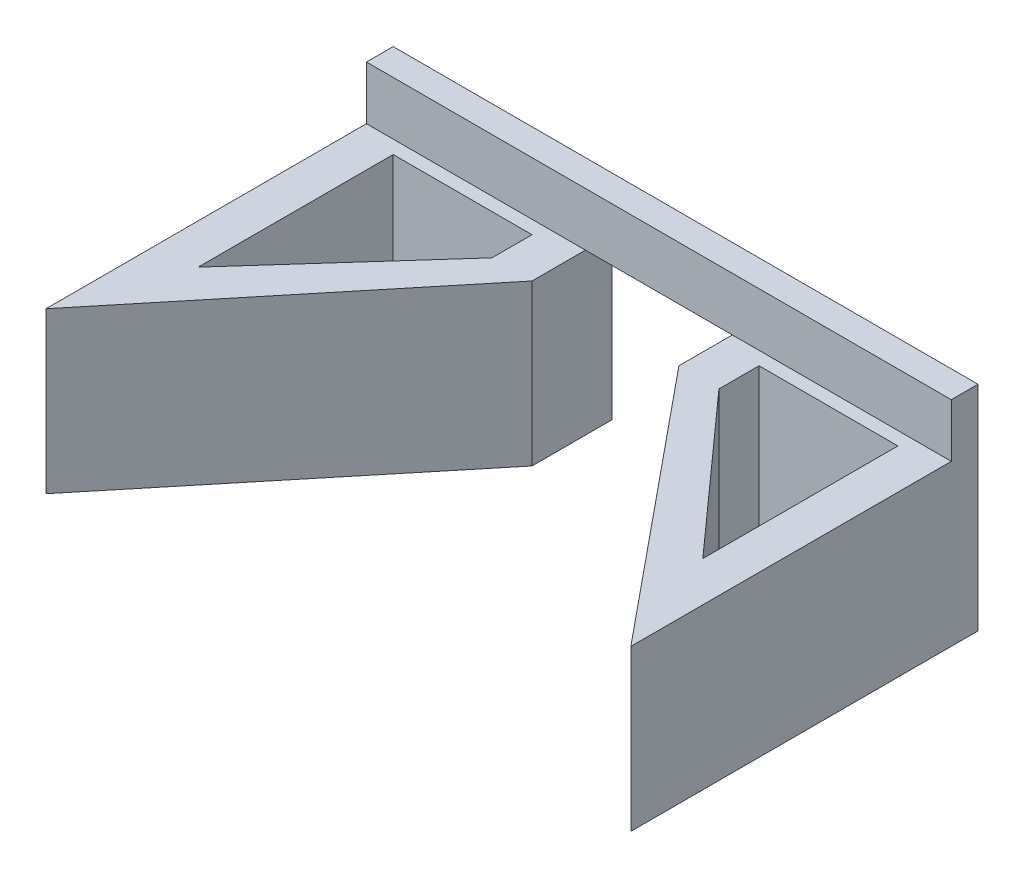
ISO-10303-21;
HEADER;
FILE_DESCRIPTION(('STEP AP214'),'2;1');
FILE_NAME('part.step','',(''),(''),'','','');
FILE_SCHEMA(('AUTOMOTIVE_DESIGN { 1 0 10303 214 1 1 1 1 }'));
ENDSEC;
DATA;
#1=APPLICATION_CONTEXT('core data for automotive mechanical design processes');
#2=APPLICATION_PROTOCOL_DEFINITION('international standard','automotive_design',2000,#1);
#3=PRODUCT_CONTEXT('',#1,'mechanical');
#4=PRODUCT('Part','Part','',(#3));
#5=PRODUCT_RELATED_PRODUCT_CATEGORY('part','',(#4));
#6=PRODUCT_DEFINITION_FORMATION('','',#4);
#7=PRODUCT_DEFINITION_CONTEXT('part definition',#1,'design');
#8=PRODUCT_DEFINITION('design','',#6,#7);
#9=PRODUCT_DEFINITION_SHAPE('','',#8);
#10=(LENGTH_UNIT() NAMED_UNIT(*) SI_UNIT(.MILLI.,.METRE.));
#11=(NAMED_UNIT(*) PLANE_ANGLE_UNIT() SI_UNIT($,.RADIAN.));
#12=(NAMED_UNIT(*) SI_UNIT($,.STERADIAN.) SOLID_ANGLE_UNIT());
#13=UNCERTAINTY_MEASURE_WITH_UNIT(LENGTH_MEASURE(1.E-05),#10,'distance_accuracy_value','');
#14=(GEOMETRIC_REPRESENTATION_CONTEXT(3) GLOBAL_UNCERTAINTY_ASSIGNED_CONTEXT((#13)) GLOBAL_UNIT_ASSIGNED_CONTEXT((#10,
#11,#12)) REPRESENTATION_CONTEXT('',''));
#15=CARTESIAN_POINT('',(0.,0.,0.));
#16=DIRECTION('',(0.,0.,1.));
#17=DIRECTION('',(1.,0.,0.));
#18=AXIS2_PLACEMENT_3D('',#15,#16,#17);
#19=CARTESIAN_POINT('',(0.,60.,0.));
#20=DIRECTION('',(0.,1.,0.));
#21=DIRECTION('',(0.,0.,1.));
#22=AXIS2_PLACEMENT_3D('',#19,#20,#21);
#23=PLANE('',#22);
#24=DIRECTION('',(0.,0.,1.));
#25=VECTOR('',#24,1.);
#26=CARTESIAN_POINT('',(27.5,60.,-12.7008032128514));
#27=LINE('',#26,#25);
#28=CARTESIAN_POINT('',(27.5,60.,-42.7008032128514));
#29=VERTEX_POINT('',#28);
#30=CARTESIAN_POINT('',(27.5,60.,-32.7008032128514));
#31=VERTEX_POINT('',#30);
#32=EDGE_CURVE('E234',#29,#31,#27,.T.);
#33=ORIENTED_EDGE('',*,*,#32,.T.);
#34=DIRECTION('',(1.,0.,0.));
#35=VECTOR('',#34,1.);
#36=CARTESIAN_POINT('',(-109.5,60.,-32.7008032128514));
#37=LINE('',#36,#35);
#38=CARTESIAN_POINT('',(-27.5,60.,-32.7008032128514));
#39=VERTEX_POINT('',#38);
#40=EDGE_CURVE('E268',#39,#31,#37,.T.);
#41=ORIENTED_EDGE('',*,*,#40,.F.);
#42=DIRECTION('',(0.,0.,-1.));
#43=VECTOR('',#42,1.);
#44=CARTESIAN_POINT('',(-27.5,60.,-12.7008032128514));
#45=LINE('',#44,#43);
#46=CARTESIAN_POINT('',(-27.5,60.,-42.7008032128514));
#47=VERTEX_POINT('',#46);
#48=EDGE_CURVE('E348',#39,#47,#45,.T.);
#49=ORIENTED_EDGE('',*,*,#48,.T.);
#50=DIRECTION('',(-1.,0.,0.));
#51=VECTOR('',#50,1.);
#52=CARTESIAN_POINT('',(-109.5,60.,-42.7008032128514));
#53=LINE('',#52,#51);
#54=EDGE_CURVE('E274',#29,#47,#53,.T.);
#55=ORIENTED_EDGE('',*,*,#54,.F.);
#56=EDGE_LOOP('',(#33,#41,#49,#55));
#57=FACE_BOUND('',#56,.T.);
#58=ADVANCED_FACE('F41',(#57),#23,.F.);
#59=CARTESIAN_POINT('',(0.,60.,0.));
#60=DIRECTION('',(0.,1.,0.));
#61=DIRECTION('',(0.,0.,1.));
#62=AXIS2_PLACEMENT_3D('',#59,#60,#61);
#63=PLANE('',#62);
#64=CARTESIAN_POINT('',(-109.5,60.,-32.7008032128514));
#65=VERTEX_POINT('',#64);
#66=EDGE_CURVE('E57',#65,#39,#37,.T.);
#67=ORIENTED_EDGE('',*,*,#66,.F.);
#68=DIRECTION('',(0.,0.,1.));
#69=VECTOR('',#68,1.);
#70=CARTESIAN_POINT('',(-109.5,60.,-42.7008032128514));
#71=LINE('',#70,#69);
#72=CARTESIAN_POINT('',(-109.5,60.,87.2991967871486));
#73=VERTEX_POINT('',#72);
#74=EDGE_CURVE('E341',#65,#73,#71,.T.);
#75=ORIENTED_EDGE('',*,*,#74,.T.);
#76=DIRECTION('',(0.634079588207047,0.,-0.773267790496399));
#77=VECTOR('',#76,1.);
#78=CARTESIAN_POINT('',(-109.5,60.,87.2991967871486));
#79=LINE('',#78,#77);
#80=CARTESIAN_POINT('',(-27.5,60.,-12.7008032128514));
#81=VERTEX_POINT('',#80);
#82=EDGE_CURVE('E344',#73,#81,#79,.T.);
#83=ORIENTED_EDGE('',*,*,#82,.T.);
#84=EDGE_CURVE('E349',#81,#39,#45,.T.);
#85=ORIENTED_EDGE('',*,*,#84,.T.);
#86=EDGE_LOOP('',(#67,#75,#83,#85));
#87=FACE_BOUND('',#86,.T.);
#88=DIRECTION('',(0.,0.,1.));
#89=VECTOR('',#88,1.);
#90=CARTESIAN_POINT('',(-94.5,60.,-27.7008032128514));
#91=LINE('',#90,#89);
#92=CARTESIAN_POINT('',(-94.5,60.,-27.7008032128514));
#93=VERTEX_POINT('',#92);
#94=CARTESIAN_POINT('',(-94.5,60.,45.3501775281332));
#95=VERTEX_POINT('',#94);
#96=EDGE_CURVE('E303',#93,#95,#91,.T.);
#97=ORIENTED_EDGE('',*,*,#96,.F.);
#98=DIRECTION('',(-1.,0.,0.));
#99=VECTOR('',#98,1.);
#100=CARTESIAN_POINT('',(-42.5,60.,-27.7008032128514));
#101=LINE('',#100,#99);
#102=CARTESIAN_POINT('',(-42.5,60.,-27.7008032128514));
#103=VERTEX_POINT('',#102);
#104=EDGE_CURVE('E300',#103,#93,#101,.T.);
#105=ORIENTED_EDGE('',*,*,#104,.F.);
#106=DIRECTION('',(0.,0.,-1.));
#107=VECTOR('',#106,1.);
#108=CARTESIAN_POINT('',(-42.5,60.,-12.7008032128502));
#109=LINE('',#108,#107);
#110=CARTESIAN_POINT('',(-42.5,60.,-12.7008032128502));
#111=VERTEX_POINT('',#110);
#112=EDGE_CURVE('E310',#111,#103,#109,.T.);
#113=ORIENTED_EDGE('',*,*,#112,.F.);
#114=DIRECTION('',(0.667219821763452,0.,-0.744860865830625));
#115=VECTOR('',#114,1.);
#116=CARTESIAN_POINT('',(-94.5,60.,45.3501775281332));
#117=LINE('',#116,#115);
#118=EDGE_CURVE('E307',#95,#111,#117,.T.);
#119=ORIENTED_EDGE('',*,*,#118,.F.);
#120=EDGE_LOOP('',(#97,#105,#113,#119));
#121=FACE_BOUND('',#120,.T.);
#122=ADVANCED_FACE('F438',(#87,#121),#63,.T.);
#123=CARTESIAN_POINT('',(0.,0.,0.));
#124=DIRECTION('',(0.,1.,0.));
#125=DIRECTION('',(0.,0.,1.));
#126=AXIS2_PLACEMENT_3D('',#123,#124,#125);
#127=PLANE('',#126);
#128=DIRECTION('',(0.,0.,1.));
#129=VECTOR('',#128,1.);
#130=CARTESIAN_POINT('',(-109.5,0.,-12.7008032128514));
#131=LINE('',#130,#129);
#132=CARTESIAN_POINT('',(-109.5,0.,-42.7008032128514));
#133=VERTEX_POINT('',#132);
#134=CARTESIAN_POINT('',(-109.5,0.,87.2991967871486));
#135=VERTEX_POINT('',#134);
#136=EDGE_CURVE('E340',#133,#135,#131,.T.);
#137=ORIENTED_EDGE('',*,*,#136,.F.);
#138=DIRECTION('',(-1.,0.,0.));
#139=VECTOR('',#138,1.);
#140=CARTESIAN_POINT('',(-109.5,0.,-42.7008032128514));
#141=LINE('',#140,#139);
#142=CARTESIAN_POINT('',(-27.5,0.,-42.7008032128514));
#143=VERTEX_POINT('',#142);
#144=EDGE_CURVE('E345',#143,#133,#141,.T.);
#145=ORIENTED_EDGE('',*,*,#144,.F.);
#146=DIRECTION('',(0.,0.,-1.));
#147=VECTOR('',#146,1.);
#148=CARTESIAN_POINT('',(-27.5,0.,-12.7008032128514));
#149=LINE('',#148,#147);
#150=CARTESIAN_POINT('',(-27.5,0.,-12.7008032128514));
#151=VERTEX_POINT('',#150);
#152=EDGE_CURVE('E358',#151,#143,#149,.T.);
#153=ORIENTED_EDGE('',*,*,#152,.F.);
#154=DIRECTION('',(0.634079588207047,0.,-0.773267790496399));
#155=VECTOR('',#154,1.);
#156=CARTESIAN_POINT('',(-109.5,0.,87.2991967871486));
#157=LINE('',#156,#155);
#158=EDGE_CURVE('E355',#135,#151,#157,.T.);
#159=ORIENTED_EDGE('',*,*,#158,.F.);
#160=EDGE_LOOP('',(#137,#145,#153,#159));
#161=FACE_BOUND('',#160,.T.);
#162=DIRECTION('',(-1.,0.,0.));
#163=VECTOR('',#162,1.);
#164=CARTESIAN_POINT('',(-42.5,0.,-27.7008032128514));
#165=LINE('',#164,#163);
#166=CARTESIAN_POINT('',(-42.5,0.,-27.7008032128514));
#167=VERTEX_POINT('',#166);
#168=CARTESIAN_POINT('',(-94.5,0.,-27.7008032128514));
#169=VERTEX_POINT('',#168);
#170=EDGE_CURVE('E299',#167,#169,#165,.T.);
#171=ORIENTED_EDGE('',*,*,#170,.T.);
#172=DIRECTION('',(0.,0.,1.));
#173=VECTOR('',#172,1.);
#174=CARTESIAN_POINT('',(-94.5,0.,-27.7008032128514));
#175=LINE('',#174,#173);
#176=CARTESIAN_POINT('',(-94.5,0.,45.3501775281332));
#177=VERTEX_POINT('',#176);
#178=EDGE_CURVE('E317',#169,#177,#175,.T.);
#179=ORIENTED_EDGE('',*,*,#178,.T.);
#180=DIRECTION('',(0.667219821763452,0.,-0.744860865830625));
#181=VECTOR('',#180,1.);
#182=CARTESIAN_POINT('',(-94.5,0.,45.3501775281332));
#183=LINE('',#182,#181);
#184=CARTESIAN_POINT('',(-42.5,0.,-12.7008032128502));
#185=VERTEX_POINT('',#184);
#186=EDGE_CURVE('E321',#177,#185,#183,.T.);
#187=ORIENTED_EDGE('',*,*,#186,.T.);
#188=DIRECTION('',(0.,0.,-1.));
#189=VECTOR('',#188,1.);
#190=CARTESIAN_POINT('',(-42.5,0.,-12.7008032128502));
#191=LINE('',#190,#189);
#192=EDGE_CURVE('E304',#185,#167,#191,.T.);
#193=ORIENTED_EDGE('',*,*,#192,.T.);
#194=EDGE_LOOP('',(#171,#179,#187,#193));
#195=FACE_BOUND('',#194,.T.);
#196=ADVANCED_FACE('F384',(#161,#195),#127,.F.);
#197=CARTESIAN_POINT('',(-109.5,60.,-12.7008032128514));
#198=DIRECTION('',(1.,0.,0.));
#199=DIRECTION('',(0.,0.,-1.));
#200=AXIS2_PLACEMENT_3D('',#197,#198,#199);
#201=PLANE('',#200);
#202=ORIENTED_EDGE('',*,*,#136,.T.);
#203=DIRECTION('',(0.,-1.,0.));
#204=VECTOR('',#203,1.);
#205=CARTESIAN_POINT('',(-109.5,60.,87.2991967871486));
#206=LINE('',#205,#204);
#207=EDGE_CURVE('E11',#73,#135,#206,.T.);
#208=ORIENTED_EDGE('',*,*,#207,.F.);
#209=ORIENTED_EDGE('',*,*,#74,.F.);
#210=DIRECTION('',(0.,-1.,0.));
#211=VECTOR('',#210,1.);
#212=CARTESIAN_POINT('',(-109.5,80.,-32.7008032128514));
#213=LINE('',#212,#211);
#214=CARTESIAN_POINT('',(-109.5,80.,-32.7008032128514));
#215=VERTEX_POINT('',#214);
#216=EDGE_CURVE('E295',#215,#65,#213,.T.);
#217=ORIENTED_EDGE('',*,*,#216,.F.);
#218=DIRECTION('',(0.,0.,1.));
#219=VECTOR('',#218,1.);
#220=CARTESIAN_POINT('',(-109.5,80.,-42.7008032128514));
#221=LINE('',#220,#219);
#222=CARTESIAN_POINT('',(-109.5,80.,-42.7008032128514));
#223=VERTEX_POINT('',#222);
#224=EDGE_CURVE('E269',#223,#215,#221,.T.);
#225=ORIENTED_EDGE('',*,*,#224,.F.);
#226=DIRECTION('',(0.,-1.,0.));
#227=VECTOR('',#226,1.);
#228=CARTESIAN_POINT('',(-109.5,60.,-42.7008032128514));
#229=LINE('',#228,#227);
#230=EDGE_CURVE('E352',#223,#133,#229,.T.);
#231=ORIENTED_EDGE('',*,*,#230,.T.);
#232=EDGE_LOOP('',(#202,#208,#209,#217,#225,#231));
#233=FACE_BOUND('',#232,.T.);
#234=ADVANCED_FACE('F43',(#233),#201,.F.);
#235=CARTESIAN_POINT('',(-109.5,60.,87.2991967871486));
#236=DIRECTION('',(-0.773267790496399,0.,-0.634079588207046));
#237=DIRECTION('',(-0.634079588207047,0.,0.773267790496399));
#238=AXIS2_PLACEMENT_3D('',#235,#236,#237);
#239=PLANE('',#238);
#240=ORIENTED_EDGE('',*,*,#158,.T.);
#241=DIRECTION('',(0.,-1.,0.));
#242=VECTOR('',#241,1.);
#243=CARTESIAN_POINT('',(-27.5,60.,-12.7008032128514));
#244=LINE('',#243,#242);
#245=EDGE_CURVE('E50',#81,#151,#244,.T.);
#246=ORIENTED_EDGE('',*,*,#245,.F.);
#247=ORIENTED_EDGE('',*,*,#82,.F.);
#248=ORIENTED_EDGE('',*,*,#207,.T.);
#249=EDGE_LOOP('',(#240,#246,#247,#248));
#250=FACE_BOUND('',#249,.T.);
#251=ADVANCED_FACE('F532',(#250),#239,.F.);
#252=CARTESIAN_POINT('',(-27.5,60.,-12.7008032128514));
#253=DIRECTION('',(-1.,0.,0.));
#254=DIRECTION('',(0.,0.,1.));
#255=AXIS2_PLACEMENT_3D('',#252,#253,#254);
#256=PLANE('',#255);
#257=ORIENTED_EDGE('',*,*,#152,.T.);
#258=DIRECTION('',(0.,-1.,0.));
#259=VECTOR('',#258,1.);
#260=CARTESIAN_POINT('',(-27.5,60.,-42.7008032128514));
#261=LINE('',#260,#259);
#262=EDGE_CURVE('E367',#47,#143,#261,.T.);
#263=ORIENTED_EDGE('',*,*,#262,.F.);
#264=ORIENTED_EDGE('',*,*,#48,.F.);
#265=ORIENTED_EDGE('',*,*,#84,.F.);
#266=ORIENTED_EDGE('',*,*,#245,.T.);
#267=EDGE_LOOP('',(#257,#263,#264,#265,#266));
#268=FACE_BOUND('',#267,.T.);
#269=ADVANCED_FACE('F376',(#268),#256,.F.);
#270=CARTESIAN_POINT('',(-109.5,60.,-42.7008032128514));
#271=DIRECTION('',(0.,0.,1.));
#272=DIRECTION('',(1.,0.,0.));
#273=AXIS2_PLACEMENT_3D('',#270,#271,#272);
#274=PLANE('',#273);
#275=ORIENTED_EDGE('',*,*,#144,.T.);
#276=ORIENTED_EDGE('',*,*,#230,.F.);
#277=DIRECTION('',(-1.,0.,0.));
#278=VECTOR('',#277,1.);
#279=CARTESIAN_POINT('',(-109.5,80.,-42.7008032128514));
#280=LINE('',#279,#278);
#281=CARTESIAN_POINT('',(109.5,80.,-42.7008032128514));
#282=VERTEX_POINT('',#281);
#283=EDGE_CURVE('E280',#282,#223,#280,.T.);
#284=ORIENTED_EDGE('',*,*,#283,.F.);
#285=DIRECTION('',(0.,-1.,0.));
#286=VECTOR('',#285,1.);
#287=CARTESIAN_POINT('',(109.5,80.,-42.7008032128514));
#288=LINE('',#287,#286);
#289=CARTESIAN_POINT('',(109.5,0.,-42.7008032128514));
#290=VERTEX_POINT('',#289);
#291=EDGE_CURVE('E284',#282,#290,#288,.T.);
#292=ORIENTED_EDGE('',*,*,#291,.T.);
#293=DIRECTION('',(-1.,0.,0.));
#294=VECTOR('',#293,1.);
#295=CARTESIAN_POINT('',(109.5,0.,-42.7008032128514));
#296=LINE('',#295,#294);
#297=CARTESIAN_POINT('',(27.5,0.,-42.7008032128514));
#298=VERTEX_POINT('',#297);
#299=EDGE_CURVE('E194',#290,#298,#296,.T.);
#300=ORIENTED_EDGE('',*,*,#299,.T.);
#301=DIRECTION('',(0.,-1.,0.));
#302=VECTOR('',#301,1.);
#303=CARTESIAN_POINT('',(27.5,60.,-42.7008032128514));
#304=LINE('',#303,#302);
#305=EDGE_CURVE('E261',#29,#298,#304,.T.);
#306=ORIENTED_EDGE('',*,*,#305,.F.);
#307=ORIENTED_EDGE('',*,*,#54,.T.);
#308=ORIENTED_EDGE('',*,*,#262,.T.);
#309=EDGE_LOOP('',(#275,#276,#284,#292,#300,#306,#307,#308));
#310=FACE_BOUND('',#309,.T.);
#311=ADVANCED_FACE('F387',(#310),#274,.F.);
#312=CARTESIAN_POINT('',(-42.5,60.,-27.7008032128514));
#313=DIRECTION('',(0.,0.,1.));
#314=DIRECTION('',(1.,0.,0.));
#315=AXIS2_PLACEMENT_3D('',#312,#313,#314);
#316=PLANE('',#315);
#317=ORIENTED_EDGE('',*,*,#170,.F.);
#318=DIRECTION('',(0.,-1.,0.));
#319=VECTOR('',#318,1.);
#320=CARTESIAN_POINT('',(-42.5,60.,-27.7008032128514));
#321=LINE('',#320,#319);
#322=EDGE_CURVE('E313',#103,#167,#321,.T.);
#323=ORIENTED_EDGE('',*,*,#322,.F.);
#324=ORIENTED_EDGE('',*,*,#104,.T.);
#325=DIRECTION('',(0.,-1.,0.));
#326=VECTOR('',#325,1.);
#327=CARTESIAN_POINT('',(-94.5,60.,-27.7008032128514));
#328=LINE('',#327,#326);
#329=EDGE_CURVE('E336',#93,#169,#328,.T.);
#330=ORIENTED_EDGE('',*,*,#329,.T.);
#331=EDGE_LOOP('',(#317,#323,#324,#330));
#332=FACE_BOUND('',#331,.T.);
#333=ADVANCED_FACE('F520',(#332),#316,.T.);
#334=CARTESIAN_POINT('',(-94.5,60.,-27.7008032128514));
#335=DIRECTION('',(1.,0.,0.));
#336=DIRECTION('',(0.,0.,-1.));
#337=AXIS2_PLACEMENT_3D('',#334,#335,#336);
#338=PLANE('',#337);
#339=ORIENTED_EDGE('',*,*,#178,.F.);
#340=ORIENTED_EDGE('',*,*,#329,.F.);
#341=ORIENTED_EDGE('',*,*,#96,.T.);
#342=DIRECTION('',(0.,-1.,0.));
#343=VECTOR('',#342,1.);
#344=CARTESIAN_POINT('',(-94.5,60.,45.3501775281332));
#345=LINE('',#344,#343);
#346=EDGE_CURVE('E333',#95,#177,#345,.T.);
#347=ORIENTED_EDGE('',*,*,#346,.T.);
#348=EDGE_LOOP('',(#339,#340,#341,#347));
#349=FACE_BOUND('',#348,.T.);
#350=ADVANCED_FACE('F569',(#349),#338,.T.);
#351=CARTESIAN_POINT('',(-94.5,60.,45.3501775281332));
#352=DIRECTION('',(-0.744860865830625,0.,-0.667219821763452));
#353=DIRECTION('',(-0.667219821763452,0.,0.744860865830625));
#354=AXIS2_PLACEMENT_3D('',#351,#352,#353);
#355=PLANE('',#354);
#356=ORIENTED_EDGE('',*,*,#186,.F.);
#357=ORIENTED_EDGE('',*,*,#346,.F.);
#358=ORIENTED_EDGE('',*,*,#118,.T.);
#359=DIRECTION('',(0.,-1.,0.));
#360=VECTOR('',#359,1.);
#361=CARTESIAN_POINT('',(-42.5,60.,-12.7008032128502));
#362=LINE('',#361,#360);
#363=EDGE_CURVE('E65',#111,#185,#362,.T.);
#364=ORIENTED_EDGE('',*,*,#363,.T.);
#365=EDGE_LOOP('',(#356,#357,#358,#364));
#366=FACE_BOUND('',#365,.T.);
#367=ADVANCED_FACE('F435',(#366),#355,.T.);
#368=CARTESIAN_POINT('',(-42.5,60.,-12.7008032128502));
#369=DIRECTION('',(-1.,0.,0.));
#370=DIRECTION('',(0.,0.,1.));
#371=AXIS2_PLACEMENT_3D('',#368,#369,#370);
#372=PLANE('',#371);
#373=ORIENTED_EDGE('',*,*,#192,.F.);
#374=ORIENTED_EDGE('',*,*,#363,.F.);
#375=ORIENTED_EDGE('',*,*,#112,.T.);
#376=ORIENTED_EDGE('',*,*,#322,.T.);
#377=EDGE_LOOP('',(#373,#374,#375,#376));
#378=FACE_BOUND('',#377,.T.);
#379=ADVANCED_FACE('F428',(#378),#372,.T.);
#380=CARTESIAN_POINT('',(-109.5,80.,-32.7008032128514));
#381=DIRECTION('',(0.,0.,-1.));
#382=DIRECTION('',(-1.,0.,0.));
#383=AXIS2_PLACEMENT_3D('',#380,#381,#382);
#384=PLANE('',#383);
#385=ORIENTED_EDGE('',*,*,#66,.T.);
#386=ORIENTED_EDGE('',*,*,#40,.T.);
#387=DIRECTION('',(-1.,0.,0.));
#388=VECTOR('',#387,1.);
#389=CARTESIAN_POINT('',(-109.5,60.,-32.7008032128514));
#390=LINE('',#389,#388);
#391=CARTESIAN_POINT('',(109.5,60.,-32.7008032128514));
#392=VERTEX_POINT('',#391);
#393=EDGE_CURVE('E265',#392,#31,#390,.T.);
#394=ORIENTED_EDGE('',*,*,#393,.F.);
#395=DIRECTION('',(0.,-1.,0.));
#396=VECTOR('',#395,1.);
#397=CARTESIAN_POINT('',(109.5,80.,-32.7008032128514));
#398=LINE('',#397,#396);
#399=CARTESIAN_POINT('',(109.5,80.,-32.7008032128514));
#400=VERTEX_POINT('',#399);
#401=EDGE_CURVE('E291',#400,#392,#398,.T.);
#402=ORIENTED_EDGE('',*,*,#401,.F.);
#403=DIRECTION('',(1.,0.,0.));
#404=VECTOR('',#403,1.);
#405=CARTESIAN_POINT('',(-109.5,80.,-32.7008032128514));
#406=LINE('',#405,#404);
#407=EDGE_CURVE('E273',#215,#400,#406,.T.);
#408=ORIENTED_EDGE('',*,*,#407,.F.);
#409=ORIENTED_EDGE('',*,*,#216,.T.);
#410=EDGE_LOOP('',(#385,#386,#394,#402,#408,#409));
#411=FACE_BOUND('',#410,.T.);
#412=ADVANCED_FACE('F426',(#411),#384,.F.);
#413=CARTESIAN_POINT('',(109.5,80.,-42.7008032128514));
#414=DIRECTION('',(-1.,0.,0.));
#415=DIRECTION('',(0.,0.,1.));
#416=AXIS2_PLACEMENT_3D('',#413,#414,#415);
#417=PLANE('',#416);
#418=ORIENTED_EDGE('',*,*,#401,.T.);
#419=DIRECTION('',(0.,0.,-1.));
#420=VECTOR('',#419,1.);
#421=CARTESIAN_POINT('',(109.5,60.,-42.7008032128514));
#422=LINE('',#421,#420);
#423=CARTESIAN_POINT('',(109.5,60.,87.2991967871486));
#424=VERTEX_POINT('',#423);
#425=EDGE_CURVE('E229',#424,#392,#422,.T.);
#426=ORIENTED_EDGE('',*,*,#425,.F.);
#427=DIRECTION('',(0.,-1.,0.));
#428=VECTOR('',#427,1.);
#429=CARTESIAN_POINT('',(109.5,60.,87.2991967871486));
#430=LINE('',#429,#428);
#431=CARTESIAN_POINT('',(109.5,0.,87.2991967871486));
#432=VERTEX_POINT('',#431);
#433=EDGE_CURVE('E242',#424,#432,#430,.T.);
#434=ORIENTED_EDGE('',*,*,#433,.T.);
#435=DIRECTION('',(0.,0.,-1.));
#436=VECTOR('',#435,1.);
#437=CARTESIAN_POINT('',(109.5,0.,-12.7008032128514));
#438=LINE('',#437,#436);
#439=EDGE_CURVE('E233',#432,#290,#438,.T.);
#440=ORIENTED_EDGE('',*,*,#439,.T.);
#441=ORIENTED_EDGE('',*,*,#291,.F.);
#442=DIRECTION('',(0.,0.,-1.));
#443=VECTOR('',#442,1.);
#444=CARTESIAN_POINT('',(109.5,80.,-42.7008032128514));
#445=LINE('',#444,#443);
#446=EDGE_CURVE('E277',#400,#282,#445,.T.);
#447=ORIENTED_EDGE('',*,*,#446,.F.);
#448=EDGE_LOOP('',(#418,#426,#434,#440,#441,#447));
#449=FACE_BOUND('',#448,.T.);
#450=ADVANCED_FACE('F401',(#449),#417,.F.);
#451=CARTESIAN_POINT('',(0.,80.,0.));
#452=DIRECTION('',(0.,1.,0.));
#453=DIRECTION('',(0.,0.,1.));
#454=AXIS2_PLACEMENT_3D('',#451,#452,#453);
#455=PLANE('',#454);
#456=ORIENTED_EDGE('',*,*,#224,.T.);
#457=ORIENTED_EDGE('',*,*,#407,.T.);
#458=ORIENTED_EDGE('',*,*,#446,.T.);
#459=ORIENTED_EDGE('',*,*,#283,.T.);
#460=EDGE_LOOP('',(#456,#457,#458,#459));
#461=FACE_BOUND('',#460,.T.);
#462=ADVANCED_FACE('F394',(#461),#455,.T.);
#463=CARTESIAN_POINT('',(0.,60.,0.));
#464=DIRECTION('',(0.,-1.,0.));
#465=DIRECTION('',(0.,0.,-1.));
#466=AXIS2_PLACEMENT_3D('',#463,#464,#465);
#467=PLANE('',#466);
#468=DIRECTION('',(0.667219821763452,0.,0.744860865830625));
#469=VECTOR('',#468,1.);
#470=CARTESIAN_POINT('',(94.5,60.,45.3501775281332));
#471=LINE('',#470,#469);
#472=CARTESIAN_POINT('',(42.5,60.,-12.7008032128502));
#473=VERTEX_POINT('',#472);
#474=CARTESIAN_POINT('',(94.5,60.,45.3501775281332));
#475=VERTEX_POINT('',#474);
#476=EDGE_CURVE('E174',#473,#475,#471,.T.);
#477=ORIENTED_EDGE('',*,*,#476,.F.);
#478=DIRECTION('',(0.,0.,1.));
#479=VECTOR('',#478,1.);
#480=CARTESIAN_POINT('',(42.5,60.,-12.7008032128502));
#481=LINE('',#480,#479);
#482=CARTESIAN_POINT('',(42.5,60.,-27.7008032128514));
#483=VERTEX_POINT('',#482);
#484=EDGE_CURVE('E205',#483,#473,#481,.T.);
#485=ORIENTED_EDGE('',*,*,#484,.F.);
#486=DIRECTION('',(-1.,0.,0.));
#487=VECTOR('',#486,1.);
#488=CARTESIAN_POINT('',(42.5,60.,-27.7008032128514));
#489=LINE('',#488,#487);
#490=CARTESIAN_POINT('',(94.5,60.,-27.7008032128514));
#491=VERTEX_POINT('',#490);
#492=EDGE_CURVE('E201',#491,#483,#489,.T.);
#493=ORIENTED_EDGE('',*,*,#492,.F.);
#494=DIRECTION('',(0.,0.,-1.));
#495=VECTOR('',#494,1.);
#496=CARTESIAN_POINT('',(94.5,60.,-27.7008032128514));
#497=LINE('',#496,#495);
#498=EDGE_CURVE('E185',#475,#491,#497,.T.);
#499=ORIENTED_EDGE('',*,*,#498,.F.);
#500=EDGE_LOOP('',(#477,#485,#493,#499));
#501=FACE_BOUND('',#500,.T.);
#502=ORIENTED_EDGE('',*,*,#425,.T.);
#503=ORIENTED_EDGE('',*,*,#393,.T.);
#504=CARTESIAN_POINT('',(27.5,60.,-12.7008032128514));
#505=VERTEX_POINT('',#504);
#506=EDGE_CURVE('E232',#31,#505,#27,.T.);
#507=ORIENTED_EDGE('',*,*,#506,.T.);
#508=DIRECTION('',(0.634079588207047,0.,0.773267790496399));
#509=VECTOR('',#508,1.);
#510=CARTESIAN_POINT('',(109.5,60.,87.2991967871486));
#511=LINE('',#510,#509);
#512=EDGE_CURVE('E238',#505,#424,#511,.T.);
#513=ORIENTED_EDGE('',*,*,#512,.T.);
#514=EDGE_LOOP('',(#502,#503,#507,#513));
#515=FACE_BOUND('',#514,.T.);
#516=ADVANCED_FACE('F198',(#501,#515),#467,.F.);
#517=CARTESIAN_POINT('',(0.,0.,0.));
#518=DIRECTION('',(0.,-1.,0.));
#519=DIRECTION('',(0.,0.,-1.));
#520=AXIS2_PLACEMENT_3D('',#517,#518,#519);
#521=PLANE('',#520);
#522=ORIENTED_EDGE('',*,*,#299,.F.);
#523=ORIENTED_EDGE('',*,*,#439,.F.);
#524=DIRECTION('',(0.634079588207047,0.,0.773267790496399));
#525=VECTOR('',#524,1.);
#526=CARTESIAN_POINT('',(109.5,0.,87.2991967871486));
#527=LINE('',#526,#525);
#528=CARTESIAN_POINT('',(27.5,0.,-12.7008032128514));
#529=VERTEX_POINT('',#528);
#530=EDGE_CURVE('E248',#529,#432,#527,.T.);
#531=ORIENTED_EDGE('',*,*,#530,.F.);
#532=DIRECTION('',(0.,0.,1.));
#533=VECTOR('',#532,1.);
#534=CARTESIAN_POINT('',(27.5,0.,-12.7008032128514));
#535=LINE('',#534,#533);
#536=EDGE_CURVE('E245',#298,#529,#535,.T.);
#537=ORIENTED_EDGE('',*,*,#536,.F.);
#538=EDGE_LOOP('',(#522,#523,#531,#537));
#539=FACE_BOUND('',#538,.T.);
#540=DIRECTION('',(0.,0.,1.));
#541=VECTOR('',#540,1.);
#542=CARTESIAN_POINT('',(42.5,0.,-12.7008032128502));
#543=LINE('',#542,#541);
#544=CARTESIAN_POINT('',(42.5,0.,-27.7008032128514));
#545=VERTEX_POINT('',#544);
#546=CARTESIAN_POINT('',(42.5,0.,-12.7008032128502));
#547=VERTEX_POINT('',#546);
#548=EDGE_CURVE('E186',#545,#547,#543,.T.);
#549=ORIENTED_EDGE('',*,*,#548,.T.);
#550=DIRECTION('',(0.667219821763452,0.,0.744860865830625));
#551=VECTOR('',#550,1.);
#552=CARTESIAN_POINT('',(94.5,0.,45.3501775281332));
#553=LINE('',#552,#551);
#554=CARTESIAN_POINT('',(94.5,0.,45.3501775281332));
#555=VERTEX_POINT('',#554);
#556=EDGE_CURVE('E210',#547,#555,#553,.T.);
#557=ORIENTED_EDGE('',*,*,#556,.T.);
#558=DIRECTION('',(0.,0.,-1.));
#559=VECTOR('',#558,1.);
#560=CARTESIAN_POINT('',(94.5,0.,-27.7008032128514));
#561=LINE('',#560,#559);
#562=CARTESIAN_POINT('',(94.5,0.,-27.7008032128514));
#563=VERTEX_POINT('',#562);
#564=EDGE_CURVE('E192',#555,#563,#561,.T.);
#565=ORIENTED_EDGE('',*,*,#564,.T.);
#566=DIRECTION('',(-1.,0.,0.));
#567=VECTOR('',#566,1.);
#568=CARTESIAN_POINT('',(42.5,0.,-27.7008032128514));
#569=LINE('',#568,#567);
#570=EDGE_CURVE('E215',#563,#545,#569,.T.);
#571=ORIENTED_EDGE('',*,*,#570,.T.);
#572=EDGE_LOOP('',(#549,#557,#565,#571));
#573=FACE_BOUND('',#572,.T.);
#574=ADVANCED_FACE('F406',(#539,#573),#521,.T.);
#575=CARTESIAN_POINT('',(27.5,60.,-12.7008032128514));
#576=DIRECTION('',(1.,0.,0.));
#577=DIRECTION('',(0.,0.,-1.));
#578=AXIS2_PLACEMENT_3D('',#575,#576,#577);
#579=PLANE('',#578);
#580=ORIENTED_EDGE('',*,*,#536,.T.);
#581=DIRECTION('',(0.,-1.,0.));
#582=VECTOR('',#581,1.);
#583=CARTESIAN_POINT('',(27.5,60.,-12.7008032128514));
#584=LINE('',#583,#582);
#585=EDGE_CURVE('E257',#505,#529,#584,.T.);
#586=ORIENTED_EDGE('',*,*,#585,.F.);
#587=ORIENTED_EDGE('',*,*,#506,.F.);
#588=ORIENTED_EDGE('',*,*,#32,.F.);
#589=ORIENTED_EDGE('',*,*,#305,.T.);
#590=EDGE_LOOP('',(#580,#586,#587,#588,#589));
#591=FACE_BOUND('',#590,.T.);
#592=ADVANCED_FACE('F410',(#591),#579,.F.);
#593=CARTESIAN_POINT('',(109.5,60.,87.2991967871486));
#594=DIRECTION('',(0.773267790496399,0.,-0.634079588207047));
#595=DIRECTION('',(-0.634079588207047,0.,-0.773267790496399));
#596=AXIS2_PLACEMENT_3D('',#593,#594,#595);
#597=PLANE('',#596);
#598=ORIENTED_EDGE('',*,*,#530,.T.);
#599=ORIENTED_EDGE('',*,*,#433,.F.);
#600=ORIENTED_EDGE('',*,*,#512,.F.);
#601=ORIENTED_EDGE('',*,*,#585,.T.);
#602=EDGE_LOOP('',(#598,#599,#600,#601));
#603=FACE_BOUND('',#602,.T.);
#604=ADVANCED_FACE('F415',(#603),#597,.F.);
#605=CARTESIAN_POINT('',(94.5,60.,45.3501775281332));
#606=DIRECTION('',(0.744860865830624,0.,-0.667219821763452));
#607=DIRECTION('',(-0.667219821763452,0.,-0.744860865830624));
#608=AXIS2_PLACEMENT_3D('',#605,#606,#607);
#609=PLANE('',#608);
#610=ORIENTED_EDGE('',*,*,#556,.F.);
#611=DIRECTION('',(0.,-1.,0.));
#612=VECTOR('',#611,1.);
#613=CARTESIAN_POINT('',(42.5,60.,-12.7008032128502));
#614=LINE('',#613,#612);
#615=EDGE_CURVE('E180',#473,#547,#614,.T.);
#616=ORIENTED_EDGE('',*,*,#615,.F.);
#617=ORIENTED_EDGE('',*,*,#476,.T.);
#618=DIRECTION('',(0.,-1.,0.));
#619=VECTOR('',#618,1.);
#620=CARTESIAN_POINT('',(94.5,60.,45.3501775281332));
#621=LINE('',#620,#619);
#622=EDGE_CURVE('E177',#475,#555,#621,.T.);
#623=ORIENTED_EDGE('',*,*,#622,.T.);
#624=EDGE_LOOP('',(#610,#616,#617,#623));
#625=FACE_BOUND('',#624,.T.);
#626=ADVANCED_FACE('F176',(#625),#609,.T.);
#627=CARTESIAN_POINT('',(94.5,60.,-27.7008032128514));
#628=DIRECTION('',(-1.,0.,0.));
#629=DIRECTION('',(0.,0.,1.));
#630=AXIS2_PLACEMENT_3D('',#627,#628,#629);
#631=PLANE('',#630);
#632=ORIENTED_EDGE('',*,*,#564,.F.);
#633=ORIENTED_EDGE('',*,*,#622,.F.);
#634=ORIENTED_EDGE('',*,*,#498,.T.);
#635=DIRECTION('',(0.,-1.,0.));
#636=VECTOR('',#635,1.);
#637=CARTESIAN_POINT('',(94.5,60.,-27.7008032128514));
#638=LINE('',#637,#636);
#639=EDGE_CURVE('E195',#491,#563,#638,.T.);
#640=ORIENTED_EDGE('',*,*,#639,.T.);
#641=EDGE_LOOP('',(#632,#633,#634,#640));
#642=FACE_BOUND('',#641,.T.);
#643=ADVANCED_FACE('F189',(#642),#631,.T.);
#644=CARTESIAN_POINT('',(42.5,60.,-27.7008032128514));
#645=DIRECTION('',(0.,0.,1.));
#646=DIRECTION('',(1.,0.,0.));
#647=AXIS2_PLACEMENT_3D('',#644,#645,#646);
#648=PLANE('',#647);
#649=ORIENTED_EDGE('',*,*,#570,.F.);
#650=ORIENTED_EDGE('',*,*,#639,.F.);
#651=ORIENTED_EDGE('',*,*,#492,.T.);
#652=DIRECTION('',(0.,-1.,0.));
#653=VECTOR('',#652,1.);
#654=CARTESIAN_POINT('',(42.5,60.,-27.7008032128514));
#655=LINE('',#654,#653);
#656=EDGE_CURVE('E224',#483,#545,#655,.T.);
#657=ORIENTED_EDGE('',*,*,#656,.T.);
#658=EDGE_LOOP('',(#649,#650,#651,#657));
#659=FACE_BOUND('',#658,.T.);
#660=ADVANCED_FACE('F459',(#659),#648,.T.);
#661=CARTESIAN_POINT('',(42.5,60.,-12.7008032128502));
#662=DIRECTION('',(1.,0.,0.));
#663=DIRECTION('',(0.,0.,-1.));
#664=AXIS2_PLACEMENT_3D('',#661,#662,#663);
#665=PLANE('',#664);
#666=ORIENTED_EDGE('',*,*,#548,.F.);
#667=ORIENTED_EDGE('',*,*,#656,.F.);
#668=ORIENTED_EDGE('',*,*,#484,.T.);
#669=ORIENTED_EDGE('',*,*,#615,.T.);
#670=EDGE_LOOP('',(#666,#667,#668,#669));
#671=FACE_BOUND('',#670,.T.);
#672=ADVANCED_FACE('F462',(#671),#665,.T.);
#673=CLOSED_SHELL('',(#58,#122,#196,#234,#251,#269,#311,#333,#350,#367,#379,#412,#450,#462,#516,
#574,#592,#604,#626,#643,#660,#672));
#674=MANIFOLD_SOLID_BREP('B2',#673);
#675=ADVANCED_BREP_SHAPE_REPRESENTATION('',(#18,#674),#14);
#676=SHAPE_DEFINITION_REPRESENTATION(#9,#675);
ENDSEC;
END-ISO-10303-21;
